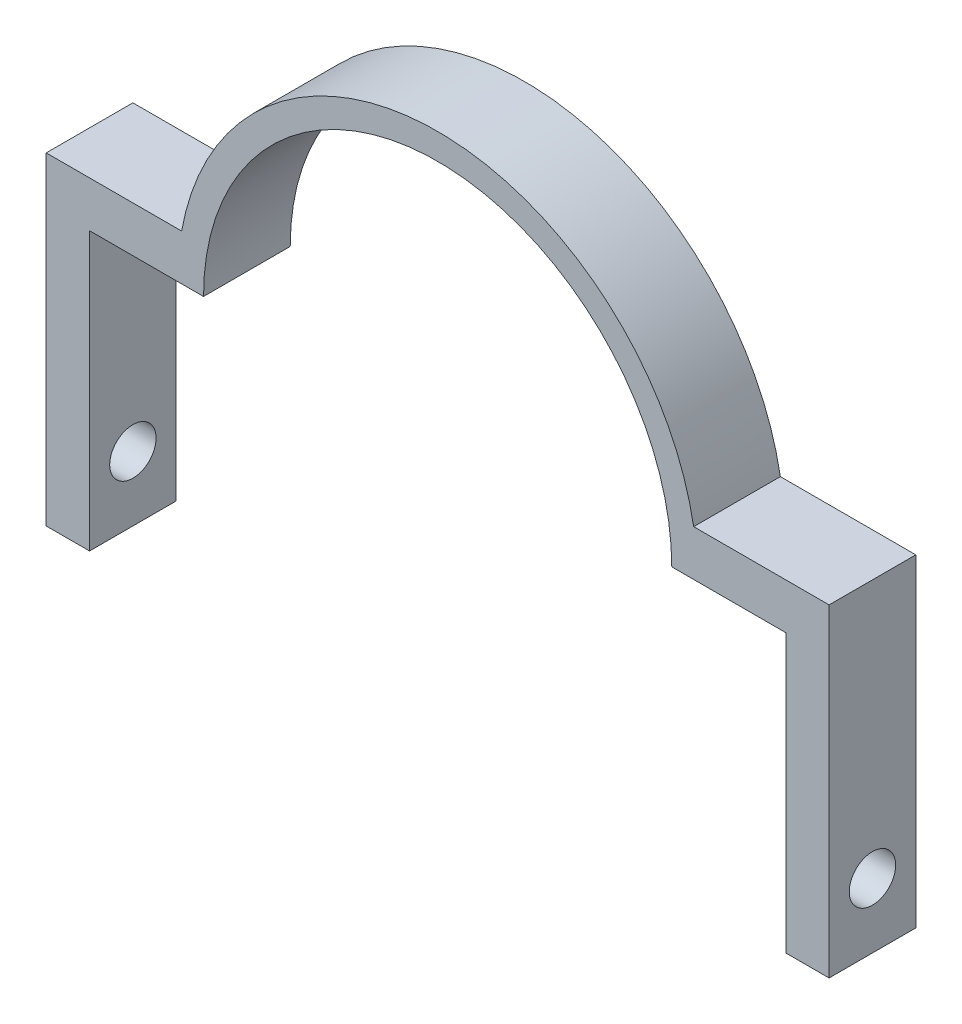
ISO-10303-21;
HEADER;
FILE_DESCRIPTION(('STEP AP214'),'2;1');
FILE_NAME('part.step','',(''),(''),'','','');
FILE_SCHEMA(('AUTOMOTIVE_DESIGN { 1 0 10303 214 1 1 1 1 }'));
ENDSEC;
DATA;
#1=APPLICATION_CONTEXT('core data for automotive mechanical design processes');
#2=APPLICATION_PROTOCOL_DEFINITION('international standard','automotive_design',2000,#1);
#3=PRODUCT_CONTEXT('',#1,'mechanical');
#4=PRODUCT('Part','Part','',(#3));
#5=PRODUCT_RELATED_PRODUCT_CATEGORY('part','',(#4));
#6=PRODUCT_DEFINITION_FORMATION('','',#4);
#7=PRODUCT_DEFINITION_CONTEXT('part definition',#1,'design');
#8=PRODUCT_DEFINITION('design','',#6,#7);
#9=PRODUCT_DEFINITION_SHAPE('','',#8);
#10=(LENGTH_UNIT() NAMED_UNIT(*) SI_UNIT(.MILLI.,.METRE.));
#11=(NAMED_UNIT(*) PLANE_ANGLE_UNIT() SI_UNIT($,.RADIAN.));
#12=(NAMED_UNIT(*) SI_UNIT($,.STERADIAN.) SOLID_ANGLE_UNIT());
#13=UNCERTAINTY_MEASURE_WITH_UNIT(LENGTH_MEASURE(1.E-05),#10,'distance_accuracy_value','');
#14=(GEOMETRIC_REPRESENTATION_CONTEXT(3) GLOBAL_UNCERTAINTY_ASSIGNED_CONTEXT((#13)) GLOBAL_UNIT_ASSIGNED_CONTEXT((#10,
#11,#12)) REPRESENTATION_CONTEXT('',''));
#15=CARTESIAN_POINT('',(0.,0.,0.));
#16=DIRECTION('',(0.,0.,1.));
#17=DIRECTION('',(1.,0.,0.));
#18=AXIS2_PLACEMENT_3D('',#15,#16,#17);
#19=CARTESIAN_POINT('',(-28.67398,-20.32,6.35));
#20=DIRECTION('',(1.,0.,0.));
#21=DIRECTION('',(0.,1.,0.));
#22=AXIS2_PLACEMENT_3D('',#19,#20,#21);
#23=PLANE('',#22);
#24=CARTESIAN_POINT('',(-28.67398,-15.5878422506403,3.175));
#25=DIRECTION('',(1.,0.,0.));
#26=DIRECTION('',(0.,1.,0.));
#27=AXIS2_PLACEMENT_3D('',#24,#25,#26);
#28=CIRCLE('',#27,1.700000029);
#29=CARTESIAN_POINT('',(-28.67398,-13.8878422216403,3.175));
#30=VERTEX_POINT('',#29);
#31=EDGE_CURVE('E265',#30,#30,#28,.T.);
#32=ORIENTED_EDGE('',*,*,#31,.T.);
#33=EDGE_LOOP('',(#32));
#34=FACE_BOUND('',#33,.T.);
#35=DIRECTION('',(0.,-1.,0.));
#36=VECTOR('',#35,1.);
#37=CARTESIAN_POINT('',(-28.67398,-20.32,0.));
#38=LINE('',#37,#36);
#39=CARTESIAN_POINT('',(-28.67398,3.35014374935966,0.));
#40=VERTEX_POINT('',#39);
#41=CARTESIAN_POINT('',(-28.67398,-20.32,0.));
#42=VERTEX_POINT('',#41);
#43=EDGE_CURVE('E157',#40,#42,#38,.T.);
#44=ORIENTED_EDGE('',*,*,#43,.T.);
#45=DIRECTION('',(0.,0.,-1.));
#46=VECTOR('',#45,1.);
#47=CARTESIAN_POINT('',(-28.67398,-20.32,6.35));
#48=LINE('',#47,#46);
#49=CARTESIAN_POINT('',(-28.67398,-20.32,6.35));
#50=VERTEX_POINT('',#49);
#51=EDGE_CURVE('E11',#50,#42,#48,.T.);
#52=ORIENTED_EDGE('',*,*,#51,.F.);
#53=DIRECTION('',(0.,-1.,0.));
#54=VECTOR('',#53,1.);
#55=CARTESIAN_POINT('',(-28.67398,-20.32,6.35));
#56=LINE('',#55,#54);
#57=CARTESIAN_POINT('',(-28.67398,3.35014374935966,6.35));
#58=VERTEX_POINT('',#57);
#59=EDGE_CURVE('E180',#58,#50,#56,.T.);
#60=ORIENTED_EDGE('',*,*,#59,.F.);
#61=DIRECTION('',(0.,0.,-1.));
#62=VECTOR('',#61,1.);
#63=CARTESIAN_POINT('',(-28.67398,3.35014374935966,6.35));
#64=LINE('',#63,#62);
#65=EDGE_CURVE('E153',#58,#40,#64,.T.);
#66=ORIENTED_EDGE('',*,*,#65,.T.);
#67=EDGE_LOOP('',(#44,#52,#60,#66));
#68=FACE_BOUND('',#67,.T.);
#69=ADVANCED_FACE('F37',(#34,#68),#23,.F.);
#70=CARTESIAN_POINT('',(-25.49898,-20.32,6.35));
#71=DIRECTION('',(0.,1.,0.));
#72=DIRECTION('',(-1.,0.,0.));
#73=AXIS2_PLACEMENT_3D('',#70,#71,#72);
#74=PLANE('',#73);
#75=DIRECTION('',(1.,0.,0.));
#76=VECTOR('',#75,1.);
#77=CARTESIAN_POINT('',(-25.49898,-20.32,0.));
#78=LINE('',#77,#76);
#79=CARTESIAN_POINT('',(-25.49898,-20.32,0.));
#80=VERTEX_POINT('',#79);
#81=EDGE_CURVE('E160',#42,#80,#78,.T.);
#82=ORIENTED_EDGE('',*,*,#81,.T.);
#83=DIRECTION('',(0.,0.,-1.));
#84=VECTOR('',#83,1.);
#85=CARTESIAN_POINT('',(-25.49898,-20.32,6.35));
#86=LINE('',#85,#84);
#87=CARTESIAN_POINT('',(-25.49898,-20.32,6.35));
#88=VERTEX_POINT('',#87);
#89=EDGE_CURVE('E45',#88,#80,#86,.T.);
#90=ORIENTED_EDGE('',*,*,#89,.F.);
#91=DIRECTION('',(1.,0.,0.));
#92=VECTOR('',#91,1.);
#93=CARTESIAN_POINT('',(-25.49898,-20.32,6.35));
#94=LINE('',#93,#92);
#95=EDGE_CURVE('E108',#50,#88,#94,.T.);
#96=ORIENTED_EDGE('',*,*,#95,.F.);
#97=ORIENTED_EDGE('',*,*,#51,.T.);
#98=EDGE_LOOP('',(#82,#90,#96,#97));
#99=FACE_BOUND('',#98,.T.);
#100=ADVANCED_FACE('F258',(#99),#74,.F.);
#101=CARTESIAN_POINT('',(-25.49898,0.,6.35));
#102=DIRECTION('',(-1.,0.,0.));
#103=DIRECTION('',(0.,-1.,0.));
#104=AXIS2_PLACEMENT_3D('',#101,#102,#103);
#105=PLANE('',#104);
#106=CARTESIAN_POINT('',(-25.49898,-15.5878422506403,3.175));
#107=DIRECTION('',(-1.,0.,0.));
#108=DIRECTION('',(0.,-1.,0.));
#109=AXIS2_PLACEMENT_3D('',#106,#107,#108);
#110=CIRCLE('',#109,1.700000029);
#111=CARTESIAN_POINT('',(-25.49898,-17.2878422796404,3.175));
#112=VERTEX_POINT('',#111);
#113=EDGE_CURVE('E161',#112,#112,#110,.T.);
#114=ORIENTED_EDGE('',*,*,#113,.T.);
#115=EDGE_LOOP('',(#114));
#116=FACE_BOUND('',#115,.T.);
#117=DIRECTION('',(0.,1.,0.));
#118=VECTOR('',#117,1.);
#119=CARTESIAN_POINT('',(-25.49898,0.,0.));
#120=LINE('',#119,#118);
#121=CARTESIAN_POINT('',(-25.49898,0.,0.));
#122=VERTEX_POINT('',#121);
#123=EDGE_CURVE('E163',#80,#122,#120,.T.);
#124=ORIENTED_EDGE('',*,*,#123,.T.);
#125=DIRECTION('',(0.,0.,-1.));
#126=VECTOR('',#125,1.);
#127=CARTESIAN_POINT('',(-25.49898,0.,6.35));
#128=LINE('',#127,#126);
#129=CARTESIAN_POINT('',(-25.49898,0.,6.35));
#130=VERTEX_POINT('',#129);
#131=EDGE_CURVE('E199',#130,#122,#128,.T.);
#132=ORIENTED_EDGE('',*,*,#131,.F.);
#133=DIRECTION('',(0.,1.,0.));
#134=VECTOR('',#133,1.);
#135=CARTESIAN_POINT('',(-25.49898,0.,6.35));
#136=LINE('',#135,#134);
#137=EDGE_CURVE('E207',#88,#130,#136,.T.);
#138=ORIENTED_EDGE('',*,*,#137,.F.);
#139=ORIENTED_EDGE('',*,*,#89,.T.);
#140=EDGE_LOOP('',(#124,#132,#138,#139));
#141=FACE_BOUND('',#140,.T.);
#142=ADVANCED_FACE('F205',(#116,#141),#105,.F.);
#143=CARTESIAN_POINT('',(-17.15,0.,6.35));
#144=DIRECTION('',(0.,1.,0.));
#145=DIRECTION('',(-1.,0.,0.));
#146=AXIS2_PLACEMENT_3D('',#143,#144,#145);
#147=PLANE('',#146);
#148=DIRECTION('',(1.,0.,0.));
#149=VECTOR('',#148,1.);
#150=CARTESIAN_POINT('',(-17.15,0.,0.));
#151=LINE('',#150,#149);
#152=CARTESIAN_POINT('',(-17.15,0.,0.));
#153=VERTEX_POINT('',#152);
#154=EDGE_CURVE('E165',#122,#153,#151,.T.);
#155=ORIENTED_EDGE('',*,*,#154,.T.);
#156=DIRECTION('',(0.,0.,-1.));
#157=VECTOR('',#156,1.);
#158=CARTESIAN_POINT('',(-17.15,0.,6.35));
#159=LINE('',#158,#157);
#160=CARTESIAN_POINT('',(-17.15,0.,6.35));
#161=VERTEX_POINT('',#160);
#162=EDGE_CURVE('E196',#161,#153,#159,.T.);
#163=ORIENTED_EDGE('',*,*,#162,.F.);
#164=DIRECTION('',(1.,0.,0.));
#165=VECTOR('',#164,1.);
#166=CARTESIAN_POINT('',(-17.15,0.,6.35));
#167=LINE('',#166,#165);
#168=EDGE_CURVE('E225',#130,#161,#167,.T.);
#169=ORIENTED_EDGE('',*,*,#168,.F.);
#170=ORIENTED_EDGE('',*,*,#131,.T.);
#171=EDGE_LOOP('',(#155,#163,#169,#170));
#172=FACE_BOUND('',#171,.T.);
#173=ADVANCED_FACE('F216',(#172),#147,.F.);
#174=CARTESIAN_POINT('',(0.,0.,6.35));
#175=DIRECTION('',(0.,0.,-1.));
#176=DIRECTION('',(-1.,0.,0.));
#177=AXIS2_PLACEMENT_3D('',#174,#175,#176);
#178=CYLINDRICAL_SURFACE('',#177,17.15);
#179=CARTESIAN_POINT('',(0.,0.,0.));
#180=DIRECTION('',(0.,0.,-1.));
#181=DIRECTION('',(1.,0.,0.));
#182=AXIS2_PLACEMENT_3D('',#179,#180,#181);
#183=CIRCLE('',#182,17.15);
#184=CARTESIAN_POINT('',(17.15,0.,0.));
#185=VERTEX_POINT('',#184);
#186=EDGE_CURVE('E167',#153,#185,#183,.T.);
#187=ORIENTED_EDGE('',*,*,#186,.T.);
#188=DIRECTION('',(0.,0.,-1.));
#189=VECTOR('',#188,1.);
#190=CARTESIAN_POINT('',(17.15,0.,6.35));
#191=LINE('',#190,#189);
#192=CARTESIAN_POINT('',(17.15,0.,6.35));
#193=VERTEX_POINT('',#192);
#194=EDGE_CURVE('E193',#193,#185,#191,.T.);
#195=ORIENTED_EDGE('',*,*,#194,.F.);
#196=CARTESIAN_POINT('',(0.,0.,6.35));
#197=DIRECTION('',(0.,0.,-1.));
#198=DIRECTION('',(1.,0.,0.));
#199=AXIS2_PLACEMENT_3D('',#196,#197,#198);
#200=CIRCLE('',#199,17.15);
#201=EDGE_CURVE('E222',#161,#193,#200,.T.);
#202=ORIENTED_EDGE('',*,*,#201,.F.);
#203=ORIENTED_EDGE('',*,*,#162,.T.);
#204=EDGE_LOOP('',(#187,#195,#202,#203));
#205=FACE_BOUND('',#204,.T.);
#206=ADVANCED_FACE('F220',(#205),#178,.F.);
#207=CARTESIAN_POINT('',(17.15,0.,6.35));
#208=DIRECTION('',(0.,1.,0.));
#209=DIRECTION('',(-1.,0.,0.));
#210=AXIS2_PLACEMENT_3D('',#207,#208,#209);
#211=PLANE('',#210);
#212=DIRECTION('',(1.,0.,0.));
#213=VECTOR('',#212,1.);
#214=CARTESIAN_POINT('',(17.15,0.,0.));
#215=LINE('',#214,#213);
#216=CARTESIAN_POINT('',(25.49898,0.,0.));
#217=VERTEX_POINT('',#216);
#218=EDGE_CURVE('E169',#185,#217,#215,.T.);
#219=ORIENTED_EDGE('',*,*,#218,.T.);
#220=DIRECTION('',(0.,0.,-1.));
#221=VECTOR('',#220,1.);
#222=CARTESIAN_POINT('',(25.49898,0.,6.35));
#223=LINE('',#222,#221);
#224=CARTESIAN_POINT('',(25.49898,0.,6.35));
#225=VERTEX_POINT('',#224);
#226=EDGE_CURVE('E190',#225,#217,#223,.T.);
#227=ORIENTED_EDGE('',*,*,#226,.F.);
#228=DIRECTION('',(1.,0.,0.));
#229=VECTOR('',#228,1.);
#230=CARTESIAN_POINT('',(17.15,0.,6.35));
#231=LINE('',#230,#229);
#232=EDGE_CURVE('E224',#193,#225,#231,.T.);
#233=ORIENTED_EDGE('',*,*,#232,.F.);
#234=ORIENTED_EDGE('',*,*,#194,.T.);
#235=EDGE_LOOP('',(#219,#227,#233,#234));
#236=FACE_BOUND('',#235,.T.);
#237=ADVANCED_FACE('F363',(#236),#211,.F.);
#238=CARTESIAN_POINT('',(25.49898,0.,6.35));
#239=DIRECTION('',(1.,0.,0.));
#240=DIRECTION('',(0.,1.,0.));
#241=AXIS2_PLACEMENT_3D('',#238,#239,#240);
#242=PLANE('',#241);
#243=CARTESIAN_POINT('',(25.49898,-15.5878422506403,3.175));
#244=DIRECTION('',(1.,0.,0.));
#245=DIRECTION('',(0.,1.,0.));
#246=AXIS2_PLACEMENT_3D('',#243,#244,#245);
#247=CIRCLE('',#246,1.700000029);
#248=CARTESIAN_POINT('',(25.49898,-13.8878422216403,3.175));
#249=VERTEX_POINT('',#248);
#250=EDGE_CURVE('E267',#249,#249,#247,.T.);
#251=ORIENTED_EDGE('',*,*,#250,.T.);
#252=EDGE_LOOP('',(#251));
#253=FACE_BOUND('',#252,.T.);
#254=DIRECTION('',(0.,-1.,0.));
#255=VECTOR('',#254,1.);
#256=CARTESIAN_POINT('',(25.49898,0.,0.));
#257=LINE('',#256,#255);
#258=CARTESIAN_POINT('',(25.49898,-20.32,0.));
#259=VERTEX_POINT('',#258);
#260=EDGE_CURVE('E171',#217,#259,#257,.T.);
#261=ORIENTED_EDGE('',*,*,#260,.T.);
#262=DIRECTION('',(0.,0.,-1.));
#263=VECTOR('',#262,1.);
#264=CARTESIAN_POINT('',(25.49898,-20.32,6.35));
#265=LINE('',#264,#263);
#266=CARTESIAN_POINT('',(25.49898,-20.32,6.35));
#267=VERTEX_POINT('',#266);
#268=EDGE_CURVE('E187',#267,#259,#265,.T.);
#269=ORIENTED_EDGE('',*,*,#268,.F.);
#270=DIRECTION('',(0.,-1.,0.));
#271=VECTOR('',#270,1.);
#272=CARTESIAN_POINT('',(25.49898,0.,6.35));
#273=LINE('',#272,#271);
#274=EDGE_CURVE('E227',#225,#267,#273,.T.);
#275=ORIENTED_EDGE('',*,*,#274,.F.);
#276=ORIENTED_EDGE('',*,*,#226,.T.);
#277=EDGE_LOOP('',(#261,#269,#275,#276));
#278=FACE_BOUND('',#277,.T.);
#279=ADVANCED_FACE('F354',(#253,#278),#242,.F.);
#280=CARTESIAN_POINT('',(25.49898,-20.32,6.35));
#281=DIRECTION('',(0.,1.,0.));
#282=DIRECTION('',(-1.,0.,0.));
#283=AXIS2_PLACEMENT_3D('',#280,#281,#282);
#284=PLANE('',#283);
#285=DIRECTION('',(1.,0.,0.));
#286=VECTOR('',#285,1.);
#287=CARTESIAN_POINT('',(25.49898,-20.32,0.));
#288=LINE('',#287,#286);
#289=CARTESIAN_POINT('',(28.67398,-20.32,0.));
#290=VERTEX_POINT('',#289);
#291=EDGE_CURVE('E173',#259,#290,#288,.T.);
#292=ORIENTED_EDGE('',*,*,#291,.T.);
#293=DIRECTION('',(0.,0.,-1.));
#294=VECTOR('',#293,1.);
#295=CARTESIAN_POINT('',(28.67398,-20.32,6.35));
#296=LINE('',#295,#294);
#297=CARTESIAN_POINT('',(28.67398,-20.32,6.35));
#298=VERTEX_POINT('',#297);
#299=EDGE_CURVE('E184',#298,#290,#296,.T.);
#300=ORIENTED_EDGE('',*,*,#299,.F.);
#301=DIRECTION('',(1.,0.,0.));
#302=VECTOR('',#301,1.);
#303=CARTESIAN_POINT('',(25.49898,-20.32,6.35));
#304=LINE('',#303,#302);
#305=EDGE_CURVE('E233',#267,#298,#304,.T.);
#306=ORIENTED_EDGE('',*,*,#305,.F.);
#307=ORIENTED_EDGE('',*,*,#268,.T.);
#308=EDGE_LOOP('',(#292,#300,#306,#307));
#309=FACE_BOUND('',#308,.T.);
#310=ADVANCED_FACE('F239',(#309),#284,.F.);
#311=CARTESIAN_POINT('',(28.67398,-20.32,6.35));
#312=DIRECTION('',(-1.,0.,0.));
#313=DIRECTION('',(0.,-1.,0.));
#314=AXIS2_PLACEMENT_3D('',#311,#312,#313);
#315=PLANE('',#314);
#316=CARTESIAN_POINT('',(28.67398,-15.5878422506403,3.175));
#317=DIRECTION('',(1.,0.,0.));
#318=DIRECTION('',(0.,1.,0.));
#319=AXIS2_PLACEMENT_3D('',#316,#317,#318);
#320=CIRCLE('',#319,1.700000029);
#321=CARTESIAN_POINT('',(28.67398,-13.8878422216403,3.175));
#322=VERTEX_POINT('',#321);
#323=EDGE_CURVE('E268',#322,#322,#320,.T.);
#324=ORIENTED_EDGE('',*,*,#323,.F.);
#325=EDGE_LOOP('',(#324));
#326=FACE_BOUND('',#325,.T.);
#327=DIRECTION('',(0.,1.,0.));
#328=VECTOR('',#327,1.);
#329=CARTESIAN_POINT('',(28.67398,-20.32,0.));
#330=LINE('',#329,#328);
#331=CARTESIAN_POINT('',(28.67398,3.35014374935967,0.));
#332=VERTEX_POINT('',#331);
#333=EDGE_CURVE('E175',#290,#332,#330,.T.);
#334=ORIENTED_EDGE('',*,*,#333,.T.);
#335=DIRECTION('',(0.,0.,-1.));
#336=VECTOR('',#335,1.);
#337=CARTESIAN_POINT('',(28.67398,3.35014374935967,6.35));
#338=LINE('',#337,#336);
#339=CARTESIAN_POINT('',(28.67398,3.35014374935967,6.35));
#340=VERTEX_POINT('',#339);
#341=EDGE_CURVE('E148',#340,#332,#338,.T.);
#342=ORIENTED_EDGE('',*,*,#341,.F.);
#343=DIRECTION('',(0.,1.,0.));
#344=VECTOR('',#343,1.);
#345=CARTESIAN_POINT('',(28.67398,-20.32,6.35));
#346=LINE('',#345,#344);
#347=EDGE_CURVE('E139',#298,#340,#346,.T.);
#348=ORIENTED_EDGE('',*,*,#347,.F.);
#349=ORIENTED_EDGE('',*,*,#299,.T.);
#350=EDGE_LOOP('',(#334,#342,#348,#349));
#351=FACE_BOUND('',#350,.T.);
#352=ADVANCED_FACE('F243',(#326,#351),#315,.F.);
#353=CARTESIAN_POINT('',(28.67398,3.35014374935967,6.35));
#354=DIRECTION('',(0.,-1.,0.));
#355=DIRECTION('',(1.,0.,0.));
#356=AXIS2_PLACEMENT_3D('',#353,#354,#355);
#357=PLANE('',#356);
#358=DIRECTION('',(-1.,0.,0.));
#359=VECTOR('',#358,1.);
#360=CARTESIAN_POINT('',(28.67398,3.35014374935967,0.));
#361=LINE('',#360,#359);
#362=CARTESIAN_POINT('',(18.7531073920731,3.35014374935967,0.));
#363=VERTEX_POINT('',#362);
#364=EDGE_CURVE('E147',#332,#363,#361,.T.);
#365=ORIENTED_EDGE('',*,*,#364,.T.);
#366=DIRECTION('',(0.,0.,-1.));
#367=VECTOR('',#366,1.);
#368=CARTESIAN_POINT('',(18.7531073920731,3.35014374935967,6.35));
#369=LINE('',#368,#367);
#370=CARTESIAN_POINT('',(18.7531073920731,3.35014374935967,6.35));
#371=VERTEX_POINT('',#370);
#372=EDGE_CURVE('E144',#371,#363,#369,.T.);
#373=ORIENTED_EDGE('',*,*,#372,.F.);
#374=DIRECTION('',(-1.,0.,0.));
#375=VECTOR('',#374,1.);
#376=CARTESIAN_POINT('',(28.67398,3.35014374935967,6.35));
#377=LINE('',#376,#375);
#378=EDGE_CURVE('E133',#340,#371,#377,.T.);
#379=ORIENTED_EDGE('',*,*,#378,.F.);
#380=ORIENTED_EDGE('',*,*,#341,.T.);
#381=EDGE_LOOP('',(#365,#373,#379,#380));
#382=FACE_BOUND('',#381,.T.);
#383=ADVANCED_FACE('F145',(#382),#357,.F.);
#384=CARTESIAN_POINT('',(0.,0.,6.35));
#385=DIRECTION('',(0.,0.,-1.));
#386=DIRECTION('',(-1.,0.,0.));
#387=AXIS2_PLACEMENT_3D('',#384,#385,#386);
#388=CYLINDRICAL_SURFACE('',#387,19.05);
#389=CARTESIAN_POINT('',(0.,0.,0.));
#390=DIRECTION('',(0.,0.,1.));
#391=DIRECTION('',(1.,0.,0.));
#392=AXIS2_PLACEMENT_3D('',#389,#390,#391);
#393=CIRCLE('',#392,19.05);
#394=CARTESIAN_POINT('',(-18.7531073920731,3.35014374935966,0.));
#395=VERTEX_POINT('',#394);
#396=EDGE_CURVE('E94',#363,#395,#393,.T.);
#397=ORIENTED_EDGE('',*,*,#396,.T.);
#398=DIRECTION('',(0.,0.,-1.));
#399=VECTOR('',#398,1.);
#400=CARTESIAN_POINT('',(-18.7531073920731,3.35014374935966,6.35));
#401=LINE('',#400,#399);
#402=CARTESIAN_POINT('',(-18.7531073920731,3.35014374935966,6.35));
#403=VERTEX_POINT('',#402);
#404=EDGE_CURVE('E149',#403,#395,#401,.T.);
#405=ORIENTED_EDGE('',*,*,#404,.F.);
#406=CARTESIAN_POINT('',(0.,0.,6.35));
#407=DIRECTION('',(0.,0.,1.));
#408=DIRECTION('',(1.,0.,0.));
#409=AXIS2_PLACEMENT_3D('',#406,#407,#408);
#410=CIRCLE('',#409,19.05);
#411=EDGE_CURVE('E137',#371,#403,#410,.T.);
#412=ORIENTED_EDGE('',*,*,#411,.F.);
#413=ORIENTED_EDGE('',*,*,#372,.T.);
#414=EDGE_LOOP('',(#397,#405,#412,#413));
#415=FACE_BOUND('',#414,.T.);
#416=ADVANCED_FACE('F151',(#415),#388,.T.);
#417=CARTESIAN_POINT('',(-28.67398,3.35014374935966,6.35));
#418=DIRECTION('',(0.,-1.,0.));
#419=DIRECTION('',(0.,0.,-1.));
#420=AXIS2_PLACEMENT_3D('',#417,#418,#419);
#421=PLANE('',#420);
#422=DIRECTION('',(-1.,0.,0.));
#423=VECTOR('',#422,1.);
#424=CARTESIAN_POINT('',(-28.67398,3.35014374935966,0.));
#425=LINE('',#424,#423);
#426=EDGE_CURVE('E100',#395,#40,#425,.T.);
#427=ORIENTED_EDGE('',*,*,#426,.T.);
#428=ORIENTED_EDGE('',*,*,#65,.F.);
#429=DIRECTION('',(-1.,0.,0.));
#430=VECTOR('',#429,1.);
#431=CARTESIAN_POINT('',(-28.67398,3.35014374935966,6.35));
#432=LINE('',#431,#430);
#433=EDGE_CURVE('E53',#403,#58,#432,.T.);
#434=ORIENTED_EDGE('',*,*,#433,.F.);
#435=ORIENTED_EDGE('',*,*,#404,.T.);
#436=EDGE_LOOP('',(#427,#428,#434,#435));
#437=FACE_BOUND('',#436,.T.);
#438=ADVANCED_FACE('F247',(#437),#421,.F.);
#439=CARTESIAN_POINT('',(0.,0.,6.35));
#440=DIRECTION('',(0.,0.,1.));
#441=DIRECTION('',(1.,0.,0.));
#442=AXIS2_PLACEMENT_3D('',#439,#440,#441);
#443=PLANE('',#442);
#444=ORIENTED_EDGE('',*,*,#59,.T.);
#445=ORIENTED_EDGE('',*,*,#95,.T.);
#446=ORIENTED_EDGE('',*,*,#137,.T.);
#447=ORIENTED_EDGE('',*,*,#168,.T.);
#448=ORIENTED_EDGE('',*,*,#201,.T.);
#449=ORIENTED_EDGE('',*,*,#232,.T.);
#450=ORIENTED_EDGE('',*,*,#274,.T.);
#451=ORIENTED_EDGE('',*,*,#305,.T.);
#452=ORIENTED_EDGE('',*,*,#347,.T.);
#453=ORIENTED_EDGE('',*,*,#378,.T.);
#454=ORIENTED_EDGE('',*,*,#411,.T.);
#455=ORIENTED_EDGE('',*,*,#433,.T.);
#456=EDGE_LOOP('',(#444,#445,#446,#447,#448,#449,#450,#451,#452,#453,#454,#455));
#457=FACE_BOUND('',#456,.T.);
#458=ADVANCED_FACE('F135',(#457),#443,.T.);
#459=CARTESIAN_POINT('',(0.,0.,0.));
#460=DIRECTION('',(0.,0.,1.));
#461=DIRECTION('',(1.,0.,0.));
#462=AXIS2_PLACEMENT_3D('',#459,#460,#461);
#463=PLANE('',#462);
#464=ORIENTED_EDGE('',*,*,#43,.F.);
#465=ORIENTED_EDGE('',*,*,#426,.F.);
#466=ORIENTED_EDGE('',*,*,#396,.F.);
#467=ORIENTED_EDGE('',*,*,#364,.F.);
#468=ORIENTED_EDGE('',*,*,#333,.F.);
#469=ORIENTED_EDGE('',*,*,#291,.F.);
#470=ORIENTED_EDGE('',*,*,#260,.F.);
#471=ORIENTED_EDGE('',*,*,#218,.F.);
#472=ORIENTED_EDGE('',*,*,#186,.F.);
#473=ORIENTED_EDGE('',*,*,#154,.F.);
#474=ORIENTED_EDGE('',*,*,#123,.F.);
#475=ORIENTED_EDGE('',*,*,#81,.F.);
#476=EDGE_LOOP('',(#464,#465,#466,#467,#468,#469,#470,#471,#472,#473,#474,#475));
#477=FACE_BOUND('',#476,.T.);
#478=ADVANCED_FACE('F211',(#477),#463,.F.);
#479=CARTESIAN_POINT('',(-28.67398,-15.5878422506403,3.175));
#480=DIRECTION('',(1.,0.,0.));
#481=DIRECTION('',(0.,1.,0.));
#482=AXIS2_PLACEMENT_3D('',#479,#480,#481);
#483=CYLINDRICAL_SURFACE('',#482,1.700000029);
#484=ORIENTED_EDGE('',*,*,#323,.T.);
#485=EDGE_LOOP('',(#484));
#486=FACE_BOUND('',#485,.T.);
#487=ORIENTED_EDGE('',*,*,#250,.F.);
#488=EDGE_LOOP('',(#487));
#489=FACE_BOUND('',#488,.T.);
#490=ADVANCED_FACE('F283',(#486,#489),#483,.F.);
#491=ORIENTED_EDGE('',*,*,#31,.F.);
#492=EDGE_LOOP('',(#491));
#493=FACE_BOUND('',#492,.T.);
#494=ORIENTED_EDGE('',*,*,#113,.F.);
#495=EDGE_LOOP('',(#494));
#496=FACE_BOUND('',#495,.T.);
#497=ADVANCED_FACE('F281',(#493,#496),#483,.F.);
#498=CLOSED_SHELL('',(#69,#100,#142,#173,#206,#237,#279,#310,#352,#383,#416,#438,#458,#478,#490,#497));
#499=MANIFOLD_SOLID_BREP('B2',#498);
#500=ADVANCED_BREP_SHAPE_REPRESENTATION('',(#18,#499),#14);
#501=SHAPE_DEFINITION_REPRESENTATION(#9,#500);
ENDSEC;
END-ISO-10303-21;
